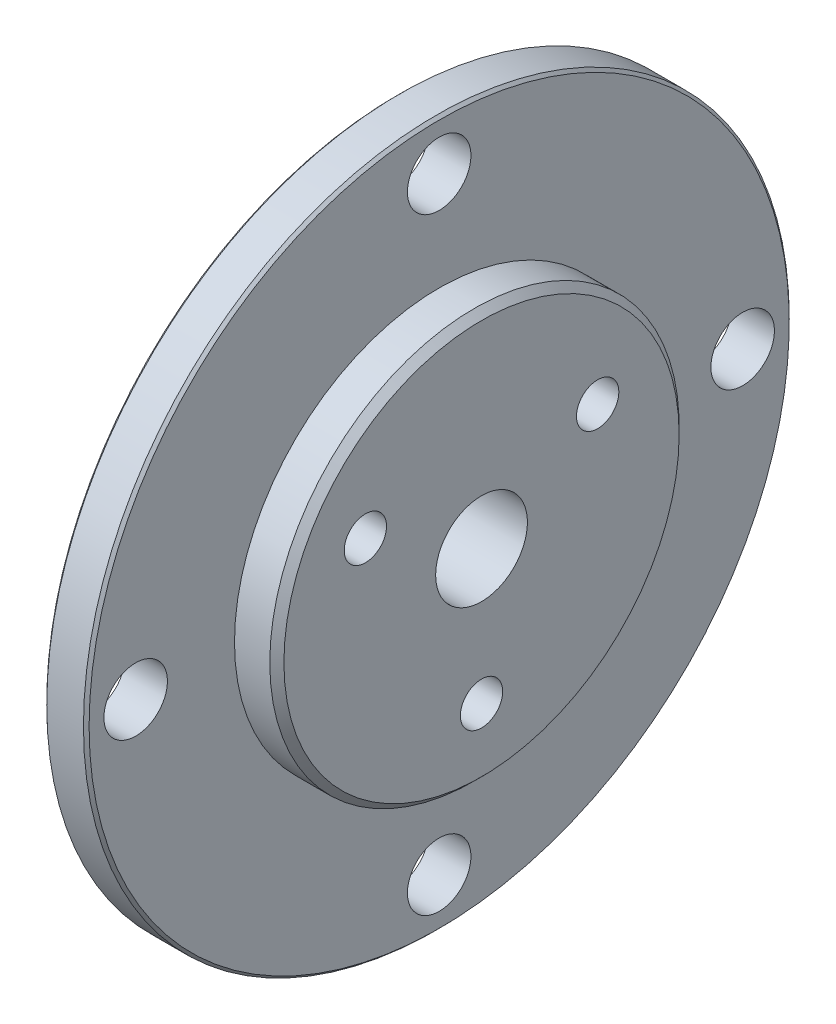
ISO-10303-21;
HEADER;
FILE_DESCRIPTION(('STEP AP214'),'2;1');
FILE_NAME('part.step','',(''),(''),'','','');
FILE_SCHEMA(('AUTOMOTIVE_DESIGN { 1 0 10303 214 1 1 1 1 }'));
ENDSEC;
DATA;
#1=APPLICATION_CONTEXT('core data for automotive mechanical design processes');
#2=APPLICATION_PROTOCOL_DEFINITION('international standard','automotive_design',2000,#1);
#3=PRODUCT_CONTEXT('',#1,'mechanical');
#4=PRODUCT('Part','Part','',(#3));
#5=PRODUCT_RELATED_PRODUCT_CATEGORY('part','',(#4));
#6=PRODUCT_DEFINITION_FORMATION('','',#4);
#7=PRODUCT_DEFINITION_CONTEXT('part definition',#1,'design');
#8=PRODUCT_DEFINITION('design','',#6,#7);
#9=PRODUCT_DEFINITION_SHAPE('','',#8);
#10=(LENGTH_UNIT() NAMED_UNIT(*) SI_UNIT(.MILLI.,.METRE.));
#11=(NAMED_UNIT(*) PLANE_ANGLE_UNIT() SI_UNIT($,.RADIAN.));
#12=(NAMED_UNIT(*) SI_UNIT($,.STERADIAN.) SOLID_ANGLE_UNIT());
#13=UNCERTAINTY_MEASURE_WITH_UNIT(LENGTH_MEASURE(1.E-05),#10,'distance_accuracy_value','');
#14=(GEOMETRIC_REPRESENTATION_CONTEXT(3) GLOBAL_UNCERTAINTY_ASSIGNED_CONTEXT((#13)) GLOBAL_UNIT_ASSIGNED_CONTEXT((#10,
#11,#12)) REPRESENTATION_CONTEXT('',''));
#15=CARTESIAN_POINT('',(0.,0.,0.));
#16=DIRECTION('',(0.,0.,1.));
#17=DIRECTION('',(1.,0.,0.));
#18=AXIS2_PLACEMENT_3D('',#15,#16,#17);
#19=CARTESIAN_POINT('',(-30.7302294197031,0.,0.));
#20=DIRECTION('',(-1.,0.,0.));
#21=DIRECTION('',(0.,0.,1.));
#22=AXIS2_PLACEMENT_3D('',#19,#20,#21);
#23=CYLINDRICAL_SURFACE('',#22,25.);
#24=CARTESIAN_POINT('',(-2.80000000000001,0.,0.));
#25=DIRECTION('',(1.,0.,0.));
#26=DIRECTION('',(0.,0.,-1.));
#27=AXIS2_PLACEMENT_3D('',#24,#25,#26);
#28=CIRCLE('',#27,25.);
#29=CARTESIAN_POINT('',(-2.80000000000001,0.,-25.));
#30=VERTEX_POINT('',#29);
#31=EDGE_CURVE('E36',#30,#30,#28,.T.);
#32=ORIENTED_EDGE('',*,*,#31,.T.);
#33=EDGE_LOOP('',(#32));
#34=FACE_BOUND('',#33,.T.);
#35=CARTESIAN_POINT('',(-0.199999999999999,0.,0.));
#36=DIRECTION('',(-1.,0.,0.));
#37=DIRECTION('',(0.,0.,1.));
#38=AXIS2_PLACEMENT_3D('',#35,#36,#37);
#39=CIRCLE('',#38,25.);
#40=CARTESIAN_POINT('',(-0.199999999999999,0.,25.));
#41=VERTEX_POINT('',#40);
#42=EDGE_CURVE('E40',#41,#41,#39,.T.);
#43=ORIENTED_EDGE('',*,*,#42,.T.);
#44=EDGE_LOOP('',(#43));
#45=FACE_BOUND('',#44,.T.);
#46=ADVANCED_FACE('F30',(#34,#45),#23,.T.);
#47=CARTESIAN_POINT('',(0.,25.,0.));
#48=DIRECTION('',(-1.,0.,0.));
#49=DIRECTION('',(0.,0.,1.));
#50=AXIS2_PLACEMENT_3D('',#47,#48,#49);
#51=PLANE('',#50);
#52=CARTESIAN_POINT('',(0.,2.25200676791555E-13,21.5));
#53=DIRECTION('',(-1.,0.,0.));
#54=DIRECTION('',(0.,0.,1.));
#55=AXIS2_PLACEMENT_3D('',#52,#53,#54);
#56=CIRCLE('',#55,2.25);
#57=CARTESIAN_POINT('',(0.,2.25200676791555E-13,23.75));
#58=VERTEX_POINT('',#57);
#59=EDGE_CURVE('E100',#58,#58,#56,.T.);
#60=ORIENTED_EDGE('',*,*,#59,.T.);
#61=EDGE_LOOP('',(#60));
#62=FACE_BOUND('',#61,.T.);
#63=CARTESIAN_POINT('',(0.,-21.5,1.50133784527703E-13));
#64=DIRECTION('',(-1.,0.,0.));
#65=DIRECTION('',(0.,0.,1.));
#66=AXIS2_PLACEMENT_3D('',#63,#64,#65);
#67=CIRCLE('',#66,2.25);
#68=CARTESIAN_POINT('',(0.,-21.5,2.25000000000015));
#69=VERTEX_POINT('',#68);
#70=EDGE_CURVE('E94',#69,#69,#67,.T.);
#71=ORIENTED_EDGE('',*,*,#70,.T.);
#72=EDGE_LOOP('',(#71));
#73=FACE_BOUND('',#72,.T.);
#74=CARTESIAN_POINT('',(0.,0.,-21.5));
#75=DIRECTION('',(-1.,0.,0.));
#76=DIRECTION('',(0.,0.,1.));
#77=AXIS2_PLACEMENT_3D('',#74,#75,#76);
#78=CIRCLE('',#77,2.25);
#79=CARTESIAN_POINT('',(0.,0.,-19.25));
#80=VERTEX_POINT('',#79);
#81=EDGE_CURVE('E88',#80,#80,#78,.T.);
#82=ORIENTED_EDGE('',*,*,#81,.T.);
#83=EDGE_LOOP('',(#82));
#84=FACE_BOUND('',#83,.T.);
#85=CARTESIAN_POINT('',(0.,21.5,0.));
#86=DIRECTION('',(-1.,0.,0.));
#87=DIRECTION('',(0.,0.,1.));
#88=AXIS2_PLACEMENT_3D('',#85,#86,#87);
#89=CIRCLE('',#88,2.25);
#90=CARTESIAN_POINT('',(0.,21.5,2.25));
#91=VERTEX_POINT('',#90);
#92=EDGE_CURVE('E82',#91,#91,#89,.T.);
#93=ORIENTED_EDGE('',*,*,#92,.T.);
#94=EDGE_LOOP('',(#93));
#95=FACE_BOUND('',#94,.T.);
#96=CARTESIAN_POINT('',(0.,0.,0.));
#97=DIRECTION('',(-1.,0.,0.));
#98=DIRECTION('',(0.,0.,1.));
#99=AXIS2_PLACEMENT_3D('',#96,#97,#98);
#100=CIRCLE('',#99,24.8);
#101=CARTESIAN_POINT('',(0.,0.,24.8));
#102=VERTEX_POINT('',#101);
#103=EDGE_CURVE('E10',#102,#102,#100,.F.);
#104=ORIENTED_EDGE('',*,*,#103,.T.);
#105=EDGE_LOOP('',(#104));
#106=FACE_BOUND('',#105,.T.);
#107=CARTESIAN_POINT('',(0.,0.,0.));
#108=DIRECTION('',(-1.,0.,0.));
#109=DIRECTION('',(0.,0.,1.));
#110=AXIS2_PLACEMENT_3D('',#107,#108,#109);
#111=CIRCLE('',#110,14.5);
#112=CARTESIAN_POINT('',(0.,0.,14.5));
#113=VERTEX_POINT('',#112);
#114=EDGE_CURVE('E55',#113,#113,#111,.T.);
#115=ORIENTED_EDGE('',*,*,#114,.T.);
#116=EDGE_LOOP('',(#115));
#117=FACE_BOUND('',#116,.T.);
#118=ADVANCED_FACE('F144',(#62,#73,#84,#95,#106,#117),#51,.F.);
#119=CARTESIAN_POINT('',(-30.7302294197031,0.,0.));
#120=DIRECTION('',(-1.,0.,0.));
#121=DIRECTION('',(0.,0.,1.));
#122=AXIS2_PLACEMENT_3D('',#119,#120,#121);
#123=CYLINDRICAL_SURFACE('',#122,14.5);
#124=CARTESIAN_POINT('',(2.5,0.,0.));
#125=DIRECTION('',(-1.,0.,0.));
#126=DIRECTION('',(0.,0.,1.));
#127=AXIS2_PLACEMENT_3D('',#124,#125,#126);
#128=CIRCLE('',#127,14.5);
#129=CARTESIAN_POINT('',(2.5,0.,14.5));
#130=VERTEX_POINT('',#129);
#131=EDGE_CURVE('E52',#130,#130,#128,.T.);
#132=ORIENTED_EDGE('',*,*,#131,.T.);
#133=EDGE_LOOP('',(#132));
#134=FACE_BOUND('',#133,.T.);
#135=ORIENTED_EDGE('',*,*,#114,.F.);
#136=EDGE_LOOP('',(#135));
#137=FACE_BOUND('',#136,.T.);
#138=ADVANCED_FACE('F139',(#134,#137),#123,.T.);
#139=CARTESIAN_POINT('',(3.,14.5,0.));
#140=DIRECTION('',(-1.,0.,0.));
#141=DIRECTION('',(0.,0.,1.));
#142=AXIS2_PLACEMENT_3D('',#139,#140,#141);
#143=PLANE('',#142);
#144=CARTESIAN_POINT('',(3.,-9.5,0.));
#145=DIRECTION('',(1.,0.,0.));
#146=DIRECTION('',(0.,0.866025403784443,0.499999999999992));
#147=AXIS2_PLACEMENT_3D('',#144,#145,#146);
#148=CIRCLE('',#147,1.5);
#149=CARTESIAN_POINT('',(3.,-8.20096189432334,0.750000000000051));
#150=VERTEX_POINT('',#149);
#151=EDGE_CURVE('E79',#150,#150,#148,.T.);
#152=ORIENTED_EDGE('',*,*,#151,.F.);
#153=EDGE_LOOP('',(#152));
#154=FACE_BOUND('',#153,.T.);
#155=CARTESIAN_POINT('',(3.,4.74999999999998,-8.22724133595218));
#156=DIRECTION('',(1.,0.,0.));
#157=DIRECTION('',(0.,-0.866025403784436,0.500000000000004));
#158=AXIS2_PLACEMENT_3D('',#155,#156,#157);
#159=CIRCLE('',#158,1.5);
#160=CARTESIAN_POINT('',(3.,3.45096189432333,-7.47724133595217));
#161=VERTEX_POINT('',#160);
#162=EDGE_CURVE('E73',#161,#161,#159,.T.);
#163=ORIENTED_EDGE('',*,*,#162,.F.);
#164=EDGE_LOOP('',(#163));
#165=FACE_BOUND('',#164,.T.);
#166=CARTESIAN_POINT('',(3.,4.74999999999998,8.22724133595218));
#167=DIRECTION('',(1.,0.,0.));
#168=DIRECTION('',(0.,0.,-1.));
#169=AXIS2_PLACEMENT_3D('',#166,#167,#168);
#170=CIRCLE('',#169,1.5);
#171=CARTESIAN_POINT('',(3.,4.74999999999998,6.72724133595218));
#172=VERTEX_POINT('',#171);
#173=EDGE_CURVE('E67',#172,#172,#170,.T.);
#174=ORIENTED_EDGE('',*,*,#173,.F.);
#175=EDGE_LOOP('',(#174));
#176=FACE_BOUND('',#175,.T.);
#177=CARTESIAN_POINT('',(3.,0.,0.));
#178=DIRECTION('',(-1.,0.,0.));
#179=DIRECTION('',(0.,0.,1.));
#180=AXIS2_PLACEMENT_3D('',#177,#178,#179);
#181=CIRCLE('',#180,14.);
#182=CARTESIAN_POINT('',(3.,0.,14.));
#183=VERTEX_POINT('',#182);
#184=EDGE_CURVE('E49',#183,#183,#181,.F.);
#185=ORIENTED_EDGE('',*,*,#184,.T.);
#186=EDGE_LOOP('',(#185));
#187=FACE_BOUND('',#186,.T.);
#188=CARTESIAN_POINT('',(3.,0.,0.));
#189=DIRECTION('',(-1.,0.,0.));
#190=DIRECTION('',(0.,0.,1.));
#191=AXIS2_PLACEMENT_3D('',#188,#189,#190);
#192=CIRCLE('',#191,3.25);
#193=CARTESIAN_POINT('',(3.,0.,3.25));
#194=VERTEX_POINT('',#193);
#195=EDGE_CURVE('E58',#194,#194,#192,.T.);
#196=ORIENTED_EDGE('',*,*,#195,.T.);
#197=EDGE_LOOP('',(#196));
#198=FACE_BOUND('',#197,.T.);
#199=ADVANCED_FACE('F133',(#154,#165,#176,#187,#198),#143,.F.);
#200=CARTESIAN_POINT('',(-30.7302294197031,0.,0.));
#201=DIRECTION('',(-1.,0.,0.));
#202=DIRECTION('',(0.,0.,1.));
#203=AXIS2_PLACEMENT_3D('',#200,#201,#202);
#204=CYLINDRICAL_SURFACE('',#203,3.25);
#205=ORIENTED_EDGE('',*,*,#195,.F.);
#206=EDGE_LOOP('',(#205));
#207=FACE_BOUND('',#206,.T.);
#208=CARTESIAN_POINT('',(-3.,0.,0.));
#209=DIRECTION('',(-1.,0.,0.));
#210=DIRECTION('',(0.,0.,1.));
#211=AXIS2_PLACEMENT_3D('',#208,#209,#210);
#212=CIRCLE('',#211,3.25);
#213=CARTESIAN_POINT('',(-3.,0.,3.25));
#214=VERTEX_POINT('',#213);
#215=EDGE_CURVE('E61',#214,#214,#212,.T.);
#216=ORIENTED_EDGE('',*,*,#215,.T.);
#217=EDGE_LOOP('',(#216));
#218=FACE_BOUND('',#217,.T.);
#219=ADVANCED_FACE('F114',(#207,#218),#204,.F.);
#220=CARTESIAN_POINT('',(-3.,3.25,0.));
#221=DIRECTION('',(1.,0.,0.));
#222=DIRECTION('',(0.,0.,-1.));
#223=AXIS2_PLACEMENT_3D('',#220,#221,#222);
#224=PLANE('',#223);
#225=CARTESIAN_POINT('',(-3.,2.25200676791555E-13,21.5));
#226=DIRECTION('',(-1.,0.,0.));
#227=DIRECTION('',(0.,-1.,0.));
#228=AXIS2_PLACEMENT_3D('',#225,#226,#227);
#229=CIRCLE('',#228,2.25);
#230=CARTESIAN_POINT('',(-3.,-2.24999999999977,21.5));
#231=VERTEX_POINT('',#230);
#232=EDGE_CURVE('E103',#231,#231,#229,.T.);
#233=ORIENTED_EDGE('',*,*,#232,.F.);
#234=EDGE_LOOP('',(#233));
#235=FACE_BOUND('',#234,.T.);
#236=CARTESIAN_POINT('',(-3.,-21.5,1.50133784527703E-13));
#237=DIRECTION('',(-1.,0.,0.));
#238=DIRECTION('',(0.,0.,-1.));
#239=AXIS2_PLACEMENT_3D('',#236,#237,#238);
#240=CIRCLE('',#239,2.25);
#241=CARTESIAN_POINT('',(-3.,-21.5,-2.24999999999985));
#242=VERTEX_POINT('',#241);
#243=EDGE_CURVE('E97',#242,#242,#240,.T.);
#244=ORIENTED_EDGE('',*,*,#243,.F.);
#245=EDGE_LOOP('',(#244));
#246=FACE_BOUND('',#245,.T.);
#247=CARTESIAN_POINT('',(-3.,0.,-21.5));
#248=DIRECTION('',(-1.,0.,0.));
#249=DIRECTION('',(0.,1.,0.));
#250=AXIS2_PLACEMENT_3D('',#247,#248,#249);
#251=CIRCLE('',#250,2.25);
#252=CARTESIAN_POINT('',(-3.,2.24999999999992,-21.5));
#253=VERTEX_POINT('',#252);
#254=EDGE_CURVE('E91',#253,#253,#251,.T.);
#255=ORIENTED_EDGE('',*,*,#254,.F.);
#256=EDGE_LOOP('',(#255));
#257=FACE_BOUND('',#256,.T.);
#258=CARTESIAN_POINT('',(-3.,21.5,0.));
#259=DIRECTION('',(-1.,0.,0.));
#260=DIRECTION('',(0.,0.,1.));
#261=AXIS2_PLACEMENT_3D('',#258,#259,#260);
#262=CIRCLE('',#261,2.25);
#263=CARTESIAN_POINT('',(-3.,21.5,2.25));
#264=VERTEX_POINT('',#263);
#265=EDGE_CURVE('E85',#264,#264,#262,.T.);
#266=ORIENTED_EDGE('',*,*,#265,.F.);
#267=EDGE_LOOP('',(#266));
#268=FACE_BOUND('',#267,.T.);
#269=CARTESIAN_POINT('',(-3.,-9.5,0.));
#270=DIRECTION('',(1.,0.,0.));
#271=DIRECTION('',(0.,0.866025403784443,0.499999999999992));
#272=AXIS2_PLACEMENT_3D('',#269,#270,#271);
#273=CIRCLE('',#272,1.5);
#274=CARTESIAN_POINT('',(-3.,-8.20096189432334,0.750000000000051));
#275=VERTEX_POINT('',#274);
#276=EDGE_CURVE('E76',#275,#275,#273,.T.);
#277=ORIENTED_EDGE('',*,*,#276,.T.);
#278=EDGE_LOOP('',(#277));
#279=FACE_BOUND('',#278,.T.);
#280=CARTESIAN_POINT('',(-3.,4.74999999999998,-8.22724133595218));
#281=DIRECTION('',(1.,0.,0.));
#282=DIRECTION('',(0.,-0.866025403784436,0.500000000000004));
#283=AXIS2_PLACEMENT_3D('',#280,#281,#282);
#284=CIRCLE('',#283,1.5);
#285=CARTESIAN_POINT('',(-3.,3.45096189432333,-7.47724133595217));
#286=VERTEX_POINT('',#285);
#287=EDGE_CURVE('E70',#286,#286,#284,.T.);
#288=ORIENTED_EDGE('',*,*,#287,.T.);
#289=EDGE_LOOP('',(#288));
#290=FACE_BOUND('',#289,.T.);
#291=CARTESIAN_POINT('',(-3.,4.74999999999998,8.22724133595218));
#292=DIRECTION('',(1.,0.,0.));
#293=DIRECTION('',(0.,0.,-1.));
#294=AXIS2_PLACEMENT_3D('',#291,#292,#293);
#295=CIRCLE('',#294,1.5);
#296=CARTESIAN_POINT('',(-3.,4.74999999999998,6.72724133595218));
#297=VERTEX_POINT('',#296);
#298=EDGE_CURVE('E64',#297,#297,#295,.T.);
#299=ORIENTED_EDGE('',*,*,#298,.T.);
#300=EDGE_LOOP('',(#299));
#301=FACE_BOUND('',#300,.T.);
#302=CARTESIAN_POINT('',(-3.,0.,0.));
#303=DIRECTION('',(1.,0.,0.));
#304=DIRECTION('',(0.,0.,-1.));
#305=AXIS2_PLACEMENT_3D('',#302,#303,#304);
#306=CIRCLE('',#305,24.8);
#307=CARTESIAN_POINT('',(-3.,0.,-24.8));
#308=VERTEX_POINT('',#307);
#309=EDGE_CURVE('E44',#308,#308,#306,.F.);
#310=ORIENTED_EDGE('',*,*,#309,.T.);
#311=EDGE_LOOP('',(#310));
#312=FACE_BOUND('',#311,.T.);
#313=ORIENTED_EDGE('',*,*,#215,.F.);
#314=EDGE_LOOP('',(#313));
#315=FACE_BOUND('',#314,.T.);
#316=ADVANCED_FACE('F110',(#235,#246,#257,#268,#279,#290,#301,#312,#315),#224,.F.);
#317=CARTESIAN_POINT('',(2.5,0.,0.));
#318=DIRECTION('',(-1.,0.,0.));
#319=DIRECTION('',(0.,0.,1.));
#320=AXIS2_PLACEMENT_3D('',#317,#318,#319);
#321=CONICAL_SURFACE('',#320,14.5,0.78539816339745);
#322=ORIENTED_EDGE('',*,*,#184,.F.);
#323=EDGE_LOOP('',(#322));
#324=FACE_BOUND('',#323,.T.);
#325=ORIENTED_EDGE('',*,*,#131,.F.);
#326=EDGE_LOOP('',(#325));
#327=FACE_BOUND('',#326,.T.);
#328=ADVANCED_FACE('F113',(#324,#327),#321,.T.);
#329=CARTESIAN_POINT('',(-3.,0.,0.));
#330=DIRECTION('',(1.,0.,0.));
#331=DIRECTION('',(0.,0.,-1.));
#332=AXIS2_PLACEMENT_3D('',#329,#330,#331);
#333=CONICAL_SURFACE('',#332,24.8,0.785398163397448);
#334=ORIENTED_EDGE('',*,*,#31,.F.);
#335=EDGE_LOOP('',(#334));
#336=FACE_BOUND('',#335,.T.);
#337=ORIENTED_EDGE('',*,*,#309,.F.);
#338=EDGE_LOOP('',(#337));
#339=FACE_BOUND('',#338,.T.);
#340=ADVANCED_FACE('F155',(#336,#339),#333,.T.);
#341=CARTESIAN_POINT('',(-0.199999999999999,0.,0.));
#342=DIRECTION('',(-1.,0.,0.));
#343=DIRECTION('',(0.,0.,1.));
#344=AXIS2_PLACEMENT_3D('',#341,#342,#343);
#345=CONICAL_SURFACE('',#344,25.,0.785398163397457);
#346=ORIENTED_EDGE('',*,*,#103,.F.);
#347=EDGE_LOOP('',(#346));
#348=FACE_BOUND('',#347,.T.);
#349=ORIENTED_EDGE('',*,*,#42,.F.);
#350=EDGE_LOOP('',(#349));
#351=FACE_BOUND('',#350,.T.);
#352=ADVANCED_FACE('F152',(#348,#351),#345,.T.);
#353=CARTESIAN_POINT('',(-3.,4.74999999999998,8.22724133595218));
#354=DIRECTION('',(1.,0.,0.));
#355=DIRECTION('',(0.,0.,-1.));
#356=AXIS2_PLACEMENT_3D('',#353,#354,#355);
#357=CYLINDRICAL_SURFACE('',#356,1.5);
#358=ORIENTED_EDGE('',*,*,#298,.F.);
#359=EDGE_LOOP('',(#358));
#360=FACE_BOUND('',#359,.T.);
#361=ORIENTED_EDGE('',*,*,#173,.T.);
#362=EDGE_LOOP('',(#361));
#363=FACE_BOUND('',#362,.T.);
#364=ADVANCED_FACE('F154',(#360,#363),#357,.F.);
#365=CARTESIAN_POINT('',(-3.,4.74999999999998,-8.22724133595218));
#366=DIRECTION('',(1.,0.,0.));
#367=DIRECTION('',(0.,0.,-1.));
#368=AXIS2_PLACEMENT_3D('',#365,#366,#367);
#369=CYLINDRICAL_SURFACE('',#368,1.5);
#370=ORIENTED_EDGE('',*,*,#287,.F.);
#371=EDGE_LOOP('',(#370));
#372=FACE_BOUND('',#371,.T.);
#373=ORIENTED_EDGE('',*,*,#162,.T.);
#374=EDGE_LOOP('',(#373));
#375=FACE_BOUND('',#374,.T.);
#376=ADVANCED_FACE('F162',(#372,#375),#369,.F.);
#377=CARTESIAN_POINT('',(-3.,-9.5,0.));
#378=DIRECTION('',(1.,0.,0.));
#379=DIRECTION('',(0.,0.,-1.));
#380=AXIS2_PLACEMENT_3D('',#377,#378,#379);
#381=CYLINDRICAL_SURFACE('',#380,1.5);
#382=ORIENTED_EDGE('',*,*,#276,.F.);
#383=EDGE_LOOP('',(#382));
#384=FACE_BOUND('',#383,.T.);
#385=ORIENTED_EDGE('',*,*,#151,.T.);
#386=EDGE_LOOP('',(#385));
#387=FACE_BOUND('',#386,.T.);
#388=ADVANCED_FACE('F203',(#384,#387),#381,.F.);
#389=CARTESIAN_POINT('',(3.,21.5,0.));
#390=DIRECTION('',(-1.,0.,0.));
#391=DIRECTION('',(0.,0.,1.));
#392=AXIS2_PLACEMENT_3D('',#389,#390,#391);
#393=CYLINDRICAL_SURFACE('',#392,2.25);
#394=ORIENTED_EDGE('',*,*,#265,.T.);
#395=EDGE_LOOP('',(#394));
#396=FACE_BOUND('',#395,.T.);
#397=ORIENTED_EDGE('',*,*,#92,.F.);
#398=EDGE_LOOP('',(#397));
#399=FACE_BOUND('',#398,.T.);
#400=ADVANCED_FACE('F212',(#396,#399),#393,.F.);
#401=CARTESIAN_POINT('',(3.,0.,-21.5));
#402=DIRECTION('',(-1.,0.,0.));
#403=DIRECTION('',(0.,0.,1.));
#404=AXIS2_PLACEMENT_3D('',#401,#402,#403);
#405=CYLINDRICAL_SURFACE('',#404,2.25);
#406=ORIENTED_EDGE('',*,*,#254,.T.);
#407=EDGE_LOOP('',(#406));
#408=FACE_BOUND('',#407,.T.);
#409=ORIENTED_EDGE('',*,*,#81,.F.);
#410=EDGE_LOOP('',(#409));
#411=FACE_BOUND('',#410,.T.);
#412=ADVANCED_FACE('F221',(#408,#411),#405,.F.);
#413=CARTESIAN_POINT('',(3.,-21.5,1.50133784527703E-13));
#414=DIRECTION('',(-1.,0.,0.));
#415=DIRECTION('',(0.,0.,1.));
#416=AXIS2_PLACEMENT_3D('',#413,#414,#415);
#417=CYLINDRICAL_SURFACE('',#416,2.25);
#418=ORIENTED_EDGE('',*,*,#243,.T.);
#419=EDGE_LOOP('',(#418));
#420=FACE_BOUND('',#419,.T.);
#421=ORIENTED_EDGE('',*,*,#70,.F.);
#422=EDGE_LOOP('',(#421));
#423=FACE_BOUND('',#422,.T.);
#424=ADVANCED_FACE('F244',(#420,#423),#417,.F.);
#425=CARTESIAN_POINT('',(3.,2.25200676791555E-13,21.5));
#426=DIRECTION('',(-1.,0.,0.));
#427=DIRECTION('',(0.,0.,1.));
#428=AXIS2_PLACEMENT_3D('',#425,#426,#427);
#429=CYLINDRICAL_SURFACE('',#428,2.25);
#430=ORIENTED_EDGE('',*,*,#232,.T.);
#431=EDGE_LOOP('',(#430));
#432=FACE_BOUND('',#431,.T.);
#433=ORIENTED_EDGE('',*,*,#59,.F.);
#434=EDGE_LOOP('',(#433));
#435=FACE_BOUND('',#434,.T.);
#436=ADVANCED_FACE('F107',(#432,#435),#429,.F.);
#437=CLOSED_SHELL('',(#46,#118,#138,#199,#219,#316,#328,#340,#352,#364,#376,#388,#400,#412,#424,#436));
#438=MANIFOLD_SOLID_BREP('B2',#437);
#439=ADVANCED_BREP_SHAPE_REPRESENTATION('',(#18,#438),#14);
#440=SHAPE_DEFINITION_REPRESENTATION(#9,#439);
ENDSEC;
END-ISO-10303-21;
